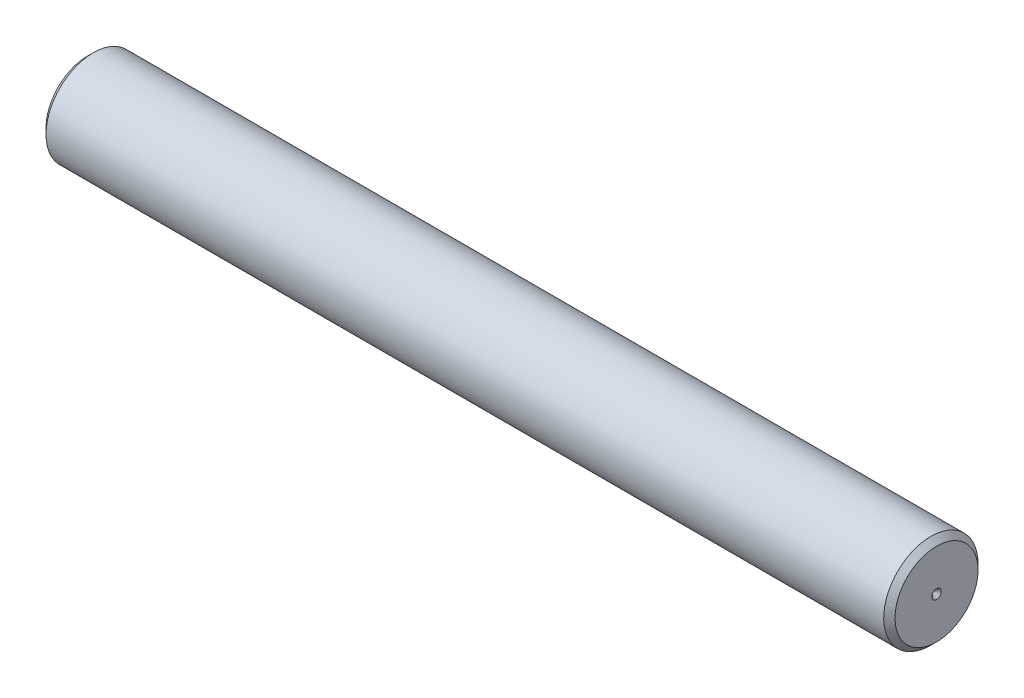
ISO-10303-21;
HEADER;
FILE_DESCRIPTION(('STEP AP214'),'2;1');
FILE_NAME('part.step','',(''),(''),'','','');
FILE_SCHEMA(('AUTOMOTIVE_DESIGN { 1 0 10303 214 1 1 1 1 }'));
ENDSEC;
DATA;
#1=APPLICATION_CONTEXT('core data for automotive mechanical design processes');
#2=APPLICATION_PROTOCOL_DEFINITION('international standard','automotive_design',2000,#1);
#3=PRODUCT_CONTEXT('',#1,'mechanical');
#4=PRODUCT('Part','Part','',(#3));
#5=PRODUCT_RELATED_PRODUCT_CATEGORY('part','',(#4));
#6=PRODUCT_DEFINITION_FORMATION('','',#4);
#7=PRODUCT_DEFINITION_CONTEXT('part definition',#1,'design');
#8=PRODUCT_DEFINITION('design','',#6,#7);
#9=PRODUCT_DEFINITION_SHAPE('','',#8);
#10=(LENGTH_UNIT() NAMED_UNIT(*) SI_UNIT(.MILLI.,.METRE.));
#11=(NAMED_UNIT(*) PLANE_ANGLE_UNIT() SI_UNIT($,.RADIAN.));
#12=(NAMED_UNIT(*) SI_UNIT($,.STERADIAN.) SOLID_ANGLE_UNIT());
#13=UNCERTAINTY_MEASURE_WITH_UNIT(LENGTH_MEASURE(1.E-05),#10,'distance_accuracy_value','');
#14=(GEOMETRIC_REPRESENTATION_CONTEXT(3) GLOBAL_UNCERTAINTY_ASSIGNED_CONTEXT((#13)) GLOBAL_UNIT_ASSIGNED_CONTEXT((#10,
#11,#12)) REPRESENTATION_CONTEXT('',''));
#15=CARTESIAN_POINT('',(0.,0.,0.));
#16=DIRECTION('',(0.,0.,1.));
#17=DIRECTION('',(1.,0.,0.));
#18=AXIS2_PLACEMENT_3D('',#15,#16,#17);
#19=CARTESIAN_POINT('',(0.,0.,0.));
#20=DIRECTION('',(1.,0.,0.));
#21=DIRECTION('',(0.,1.,0.));
#22=AXIS2_PLACEMENT_3D('',#19,#20,#21);
#23=PLANE('',#22);
#24=CARTESIAN_POINT('',(0.,0.,0.));
#25=DIRECTION('',(1.,0.,0.));
#26=DIRECTION('',(0.,1.,0.));
#27=AXIS2_PLACEMENT_3D('',#24,#25,#26);
#28=CIRCLE('',#27,0.25);
#29=CARTESIAN_POINT('',(0.,0.25,0.));
#30=VERTEX_POINT('',#29);
#31=EDGE_CURVE('E97',#30,#30,#28,.T.);
#32=ORIENTED_EDGE('',*,*,#31,.F.);
#33=EDGE_LOOP('',(#32));
#34=FACE_BOUND('',#33,.T.);
#35=CARTESIAN_POINT('',(0.,0.,0.));
#36=DIRECTION('',(1.,0.,0.));
#37=DIRECTION('',(0.,1.,0.));
#38=AXIS2_PLACEMENT_3D('',#35,#36,#37);
#39=CIRCLE('',#38,2.2);
#40=CARTESIAN_POINT('',(0.,2.2,0.));
#41=VERTEX_POINT('',#40);
#42=EDGE_CURVE('E94',#41,#41,#39,.T.);
#43=ORIENTED_EDGE('',*,*,#42,.T.);
#44=EDGE_LOOP('',(#43));
#45=FACE_BOUND('',#44,.T.);
#46=ADVANCED_FACE('F42',(#34,#45),#23,.T.);
#47=CARTESIAN_POINT('',(0.,0.,0.));
#48=DIRECTION('',(1.,0.,0.));
#49=DIRECTION('',(0.,1.,0.));
#50=AXIS2_PLACEMENT_3D('',#47,#48,#49);
#51=CYLINDRICAL_SURFACE('',#50,2.5);
#52=CARTESIAN_POINT('',(-0.300000000000005,0.,0.));
#53=DIRECTION('',(1.,0.,0.));
#54=DIRECTION('',(0.,1.,0.));
#55=AXIS2_PLACEMENT_3D('',#52,#53,#54);
#56=CIRCLE('',#55,2.5);
#57=CARTESIAN_POINT('',(-0.300000000000006,2.5,0.));
#58=VERTEX_POINT('',#57);
#59=EDGE_CURVE('E51',#58,#58,#56,.F.);
#60=ORIENTED_EDGE('',*,*,#59,.T.);
#61=EDGE_LOOP('',(#60));
#62=FACE_BOUND('',#61,.T.);
#63=CARTESIAN_POINT('',(-44.7,0.,0.));
#64=DIRECTION('',(-1.,0.,0.));
#65=DIRECTION('',(0.,-1.,0.));
#66=AXIS2_PLACEMENT_3D('',#63,#64,#65);
#67=CIRCLE('',#66,2.5);
#68=CARTESIAN_POINT('',(-44.7,-2.50000000000001,0.));
#69=VERTEX_POINT('',#68);
#70=EDGE_CURVE('E96',#69,#69,#67,.F.);
#71=ORIENTED_EDGE('',*,*,#70,.T.);
#72=EDGE_LOOP('',(#71));
#73=FACE_BOUND('',#72,.T.);
#74=ADVANCED_FACE('F68',(#62,#73),#51,.T.);
#75=CARTESIAN_POINT('',(-45.,2.49999999999999,0.));
#76=DIRECTION('',(-1.,0.,0.));
#77=DIRECTION('',(0.,-1.,0.));
#78=AXIS2_PLACEMENT_3D('',#75,#76,#77);
#79=PLANE('',#78);
#80=CARTESIAN_POINT('',(-45.,0.,0.));
#81=DIRECTION('',(1.,0.,0.));
#82=DIRECTION('',(0.,1.,0.));
#83=AXIS2_PLACEMENT_3D('',#80,#81,#82);
#84=CIRCLE('',#83,0.25000000000001);
#85=CARTESIAN_POINT('',(-45.,0.25,0.));
#86=VERTEX_POINT('',#85);
#87=EDGE_CURVE('E105',#86,#86,#84,.T.);
#88=ORIENTED_EDGE('',*,*,#87,.T.);
#89=EDGE_LOOP('',(#88));
#90=FACE_BOUND('',#89,.T.);
#91=CARTESIAN_POINT('',(-45.,0.,0.));
#92=DIRECTION('',(-1.,0.,0.));
#93=DIRECTION('',(0.,-1.,0.));
#94=AXIS2_PLACEMENT_3D('',#91,#92,#93);
#95=CIRCLE('',#94,2.2);
#96=CARTESIAN_POINT('',(-45.,-2.20000000000001,0.));
#97=VERTEX_POINT('',#96);
#98=EDGE_CURVE('E11',#97,#97,#95,.T.);
#99=ORIENTED_EDGE('',*,*,#98,.T.);
#100=EDGE_LOOP('',(#99));
#101=FACE_BOUND('',#100,.T.);
#102=ADVANCED_FACE('F74',(#90,#101),#79,.T.);
#103=CARTESIAN_POINT('',(0.,0.,0.));
#104=DIRECTION('',(-1.,0.,0.));
#105=DIRECTION('',(0.,-1.,0.));
#106=AXIS2_PLACEMENT_3D('',#103,#104,#105);
#107=CONICAL_SURFACE('',#106,2.2,0.785398163397439);
#108=ORIENTED_EDGE('',*,*,#59,.F.);
#109=EDGE_LOOP('',(#108));
#110=FACE_BOUND('',#109,.T.);
#111=ORIENTED_EDGE('',*,*,#42,.F.);
#112=EDGE_LOOP('',(#111));
#113=FACE_BOUND('',#112,.T.);
#114=ADVANCED_FACE('F80',(#110,#113),#107,.T.);
#115=CARTESIAN_POINT('',(-44.7,0.,0.));
#116=DIRECTION('',(1.,0.,0.));
#117=DIRECTION('',(0.,1.,0.));
#118=AXIS2_PLACEMENT_3D('',#115,#116,#117);
#119=CONICAL_SURFACE('',#118,2.5,0.78539816339744);
#120=ORIENTED_EDGE('',*,*,#98,.F.);
#121=EDGE_LOOP('',(#120));
#122=FACE_BOUND('',#121,.T.);
#123=ORIENTED_EDGE('',*,*,#70,.F.);
#124=EDGE_LOOP('',(#123));
#125=FACE_BOUND('',#124,.T.);
#126=ADVANCED_FACE('F44',(#122,#125),#119,.T.);
#127=CARTESIAN_POINT('',(0.,0.,0.));
#128=DIRECTION('',(1.,0.,0.));
#129=DIRECTION('',(0.,1.,0.));
#130=AXIS2_PLACEMENT_3D('',#127,#128,#129);
#131=CONICAL_SURFACE('',#130,0.25,0.785398163397448);
#132=CARTESIAN_POINT('',(-0.25,0.,0.));
#133=VERTEX_POINT('',#132);
#134=VERTEX_LOOP('',#133);
#135=FACE_BOUND('',#134,.T.);
#136=ORIENTED_EDGE('',*,*,#31,.T.);
#137=EDGE_LOOP('',(#136));
#138=FACE_BOUND('',#137,.T.);
#139=ADVANCED_FACE('F59',(#135,#138),#131,.F.);
#140=CARTESIAN_POINT('',(-44.75,0.,0.));
#141=DIRECTION('',(-1.,0.,0.));
#142=DIRECTION('',(0.,-1.,0.));
#143=AXIS2_PLACEMENT_3D('',#140,#141,#142);
#144=CONICAL_SURFACE('',#143,0.,0.785398163397467);
#145=ORIENTED_EDGE('',*,*,#87,.F.);
#146=EDGE_LOOP('',(#145));
#147=FACE_BOUND('',#146,.T.);
#148=CARTESIAN_POINT('',(-44.75,0.,0.));
#149=VERTEX_POINT('',#148);
#150=VERTEX_LOOP('',#149);
#151=FACE_BOUND('',#150,.T.);
#152=ADVANCED_FACE('F57',(#147,#151),#144,.F.);
#153=CLOSED_SHELL('',(#46,#74,#102,#114,#126,#139,#152));
#154=MANIFOLD_SOLID_BREP('B2',#153);
#155=ADVANCED_BREP_SHAPE_REPRESENTATION('',(#18,#154),#14);
#156=SHAPE_DEFINITION_REPRESENTATION(#9,#155);
ENDSEC;
END-ISO-10303-21;
